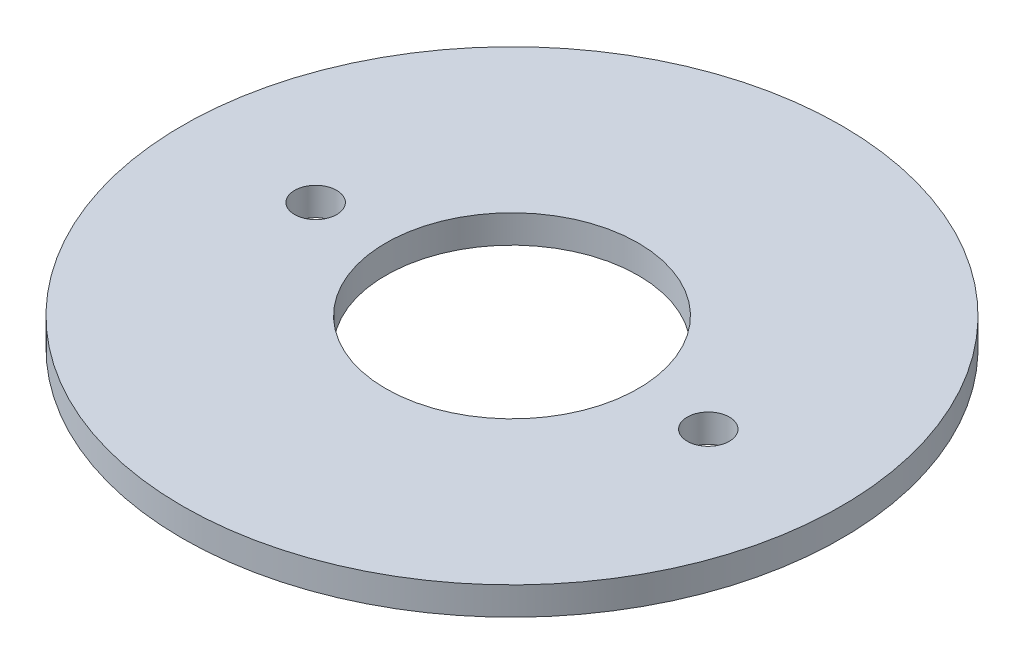
ISO-10303-21;
HEADER;
FILE_DESCRIPTION(('STEP AP214'),'2;1');
FILE_NAME('part.step','',(''),(''),'','','');
FILE_SCHEMA(('AUTOMOTIVE_DESIGN { 1 0 10303 214 1 1 1 1 }'));
ENDSEC;
DATA;
#1=APPLICATION_CONTEXT('core data for automotive mechanical design processes');
#2=APPLICATION_PROTOCOL_DEFINITION('international standard','automotive_design',2000,#1);
#3=PRODUCT_CONTEXT('',#1,'mechanical');
#4=PRODUCT('Part','Part','',(#3));
#5=PRODUCT_RELATED_PRODUCT_CATEGORY('part','',(#4));
#6=PRODUCT_DEFINITION_FORMATION('','',#4);
#7=PRODUCT_DEFINITION_CONTEXT('part definition',#1,'design');
#8=PRODUCT_DEFINITION('design','',#6,#7);
#9=PRODUCT_DEFINITION_SHAPE('','',#8);
#10=(LENGTH_UNIT() NAMED_UNIT(*) SI_UNIT(.MILLI.,.METRE.));
#11=(NAMED_UNIT(*) PLANE_ANGLE_UNIT() SI_UNIT($,.RADIAN.));
#12=(NAMED_UNIT(*) SI_UNIT($,.STERADIAN.) SOLID_ANGLE_UNIT());
#13=UNCERTAINTY_MEASURE_WITH_UNIT(LENGTH_MEASURE(1.E-05),#10,'distance_accuracy_value','');
#14=(GEOMETRIC_REPRESENTATION_CONTEXT(3) GLOBAL_UNCERTAINTY_ASSIGNED_CONTEXT((#13)) GLOBAL_UNIT_ASSIGNED_CONTEXT((#10,
#11,#12)) REPRESENTATION_CONTEXT('',''));
#15=CARTESIAN_POINT('',(0.,0.,0.));
#16=DIRECTION('',(0.,0.,1.));
#17=DIRECTION('',(1.,0.,0.));
#18=AXIS2_PLACEMENT_3D('',#15,#16,#17);
#19=CARTESIAN_POINT('',(0.,2.,0.));
#20=DIRECTION('',(0.,1.,0.));
#21=DIRECTION('',(0.,0.,1.));
#22=AXIS2_PLACEMENT_3D('',#19,#20,#21);
#23=PLANE('',#22);
#24=CARTESIAN_POINT('',(-14.,2.,0.));
#25=DIRECTION('',(0.,1.,0.));
#26=DIRECTION('',(0.,0.,1.));
#27=AXIS2_PLACEMENT_3D('',#24,#25,#26);
#28=CIRCLE('',#27,1.5);
#29=CARTESIAN_POINT('',(-14.,2.,1.5));
#30=VERTEX_POINT('',#29);
#31=EDGE_CURVE('E62',#30,#30,#28,.T.);
#32=ORIENTED_EDGE('',*,*,#31,.F.);
#33=EDGE_LOOP('',(#32));
#34=FACE_BOUND('',#33,.T.);
#35=CARTESIAN_POINT('',(0.,2.,0.));
#36=DIRECTION('',(0.,1.,0.));
#37=DIRECTION('',(0.,0.,1.));
#38=AXIS2_PLACEMENT_3D('',#35,#36,#37);
#39=CIRCLE('',#38,23.5);
#40=CARTESIAN_POINT('',(0.,2.,23.5));
#41=VERTEX_POINT('',#40);
#42=EDGE_CURVE('E12',#41,#41,#39,.T.);
#43=ORIENTED_EDGE('',*,*,#42,.T.);
#44=EDGE_LOOP('',(#43));
#45=FACE_BOUND('',#44,.T.);
#46=CARTESIAN_POINT('',(0.,2.,0.));
#47=DIRECTION('',(0.,1.,0.));
#48=DIRECTION('',(0.,0.,1.));
#49=AXIS2_PLACEMENT_3D('',#46,#47,#48);
#50=CIRCLE('',#49,9.);
#51=CARTESIAN_POINT('',(0.,2.,9.));
#52=VERTEX_POINT('',#51);
#53=EDGE_CURVE('E57',#52,#52,#50,.T.);
#54=ORIENTED_EDGE('',*,*,#53,.F.);
#55=EDGE_LOOP('',(#54));
#56=FACE_BOUND('',#55,.T.);
#57=CARTESIAN_POINT('',(14.,2.,0.));
#58=DIRECTION('',(0.,1.,0.));
#59=DIRECTION('',(0.,0.,-1.));
#60=AXIS2_PLACEMENT_3D('',#57,#58,#59);
#61=CIRCLE('',#60,1.5);
#62=CARTESIAN_POINT('',(14.,2.,-1.5));
#63=VERTEX_POINT('',#62);
#64=EDGE_CURVE('E68',#63,#63,#61,.T.);
#65=ORIENTED_EDGE('',*,*,#64,.F.);
#66=EDGE_LOOP('',(#65));
#67=FACE_BOUND('',#66,.T.);
#68=ADVANCED_FACE('F46',(#34,#45,#56,#67),#23,.T.);
#69=CARTESIAN_POINT('',(0.,0.,0.));
#70=DIRECTION('',(0.,1.,0.));
#71=DIRECTION('',(0.,0.,1.));
#72=AXIS2_PLACEMENT_3D('',#69,#70,#71);
#73=PLANE('',#72);
#74=CARTESIAN_POINT('',(0.,0.,0.));
#75=DIRECTION('',(0.,1.,0.));
#76=DIRECTION('',(0.,0.,1.));
#77=AXIS2_PLACEMENT_3D('',#74,#75,#76);
#78=CIRCLE('',#77,23.5);
#79=CARTESIAN_POINT('',(0.,0.,23.5));
#80=VERTEX_POINT('',#79);
#81=EDGE_CURVE('E50',#80,#80,#78,.T.);
#82=ORIENTED_EDGE('',*,*,#81,.F.);
#83=EDGE_LOOP('',(#82));
#84=FACE_BOUND('',#83,.T.);
#85=CARTESIAN_POINT('',(0.,0.,0.));
#86=DIRECTION('',(0.,1.,0.));
#87=DIRECTION('',(0.,0.,1.));
#88=AXIS2_PLACEMENT_3D('',#85,#86,#87);
#89=CIRCLE('',#88,9.);
#90=CARTESIAN_POINT('',(0.,0.,9.));
#91=VERTEX_POINT('',#90);
#92=EDGE_CURVE('E59',#91,#91,#89,.T.);
#93=ORIENTED_EDGE('',*,*,#92,.T.);
#94=EDGE_LOOP('',(#93));
#95=FACE_BOUND('',#94,.T.);
#96=CARTESIAN_POINT('',(-14.,0.,0.));
#97=DIRECTION('',(0.,1.,0.));
#98=DIRECTION('',(0.,0.,1.));
#99=AXIS2_PLACEMENT_3D('',#96,#97,#98);
#100=CIRCLE('',#99,1.5);
#101=CARTESIAN_POINT('',(-14.,0.,1.5));
#102=VERTEX_POINT('',#101);
#103=EDGE_CURVE('E65',#102,#102,#100,.T.);
#104=ORIENTED_EDGE('',*,*,#103,.T.);
#105=EDGE_LOOP('',(#104));
#106=FACE_BOUND('',#105,.T.);
#107=CARTESIAN_POINT('',(14.,0.,0.));
#108=DIRECTION('',(0.,1.,0.));
#109=DIRECTION('',(0.,0.,-1.));
#110=AXIS2_PLACEMENT_3D('',#107,#108,#109);
#111=CIRCLE('',#110,1.5);
#112=CARTESIAN_POINT('',(14.,0.,-1.5));
#113=VERTEX_POINT('',#112);
#114=EDGE_CURVE('E71',#113,#113,#111,.T.);
#115=ORIENTED_EDGE('',*,*,#114,.T.);
#116=EDGE_LOOP('',(#115));
#117=FACE_BOUND('',#116,.T.);
#118=ADVANCED_FACE('F81',(#84,#95,#106,#117),#73,.F.);
#119=CARTESIAN_POINT('',(0.,2.,0.));
#120=DIRECTION('',(0.,-1.,0.));
#121=DIRECTION('',(0.,0.,-1.));
#122=AXIS2_PLACEMENT_3D('',#119,#120,#121);
#123=CYLINDRICAL_SURFACE('',#122,23.5);
#124=ORIENTED_EDGE('',*,*,#42,.F.);
#125=EDGE_LOOP('',(#124));
#126=FACE_BOUND('',#125,.T.);
#127=ORIENTED_EDGE('',*,*,#81,.T.);
#128=EDGE_LOOP('',(#127));
#129=FACE_BOUND('',#128,.T.);
#130=ADVANCED_FACE('F48',(#126,#129),#123,.T.);
#131=CARTESIAN_POINT('',(0.,2.,0.));
#132=DIRECTION('',(0.,-1.,0.));
#133=DIRECTION('',(0.,0.,-1.));
#134=AXIS2_PLACEMENT_3D('',#131,#132,#133);
#135=CYLINDRICAL_SURFACE('',#134,9.);
#136=ORIENTED_EDGE('',*,*,#53,.T.);
#137=EDGE_LOOP('',(#136));
#138=FACE_BOUND('',#137,.T.);
#139=ORIENTED_EDGE('',*,*,#92,.F.);
#140=EDGE_LOOP('',(#139));
#141=FACE_BOUND('',#140,.T.);
#142=ADVANCED_FACE('F90',(#138,#141),#135,.F.);
#143=CARTESIAN_POINT('',(-14.,2.,0.));
#144=DIRECTION('',(0.,-1.,0.));
#145=DIRECTION('',(0.,0.,-1.));
#146=AXIS2_PLACEMENT_3D('',#143,#144,#145);
#147=CYLINDRICAL_SURFACE('',#146,1.5);
#148=ORIENTED_EDGE('',*,*,#31,.T.);
#149=EDGE_LOOP('',(#148));
#150=FACE_BOUND('',#149,.T.);
#151=ORIENTED_EDGE('',*,*,#103,.F.);
#152=EDGE_LOOP('',(#151));
#153=FACE_BOUND('',#152,.T.);
#154=ADVANCED_FACE('F93',(#150,#153),#147,.F.);
#155=CARTESIAN_POINT('',(14.,2.,0.));
#156=DIRECTION('',(0.,-1.,0.));
#157=DIRECTION('',(0.,0.,-1.));
#158=AXIS2_PLACEMENT_3D('',#155,#156,#157);
#159=CYLINDRICAL_SURFACE('',#158,1.5);
#160=ORIENTED_EDGE('',*,*,#64,.T.);
#161=EDGE_LOOP('',(#160));
#162=FACE_BOUND('',#161,.T.);
#163=ORIENTED_EDGE('',*,*,#114,.F.);
#164=EDGE_LOOP('',(#163));
#165=FACE_BOUND('',#164,.T.);
#166=ADVANCED_FACE('F77',(#162,#165),#159,.F.);
#167=CLOSED_SHELL('',(#68,#118,#130,#142,#154,#166));
#168=MANIFOLD_SOLID_BREP('B2',#167);
#169=ADVANCED_BREP_SHAPE_REPRESENTATION('',(#18,#168),#14);
#170=SHAPE_DEFINITION_REPRESENTATION(#9,#169);
ENDSEC;
END-ISO-10303-21;
